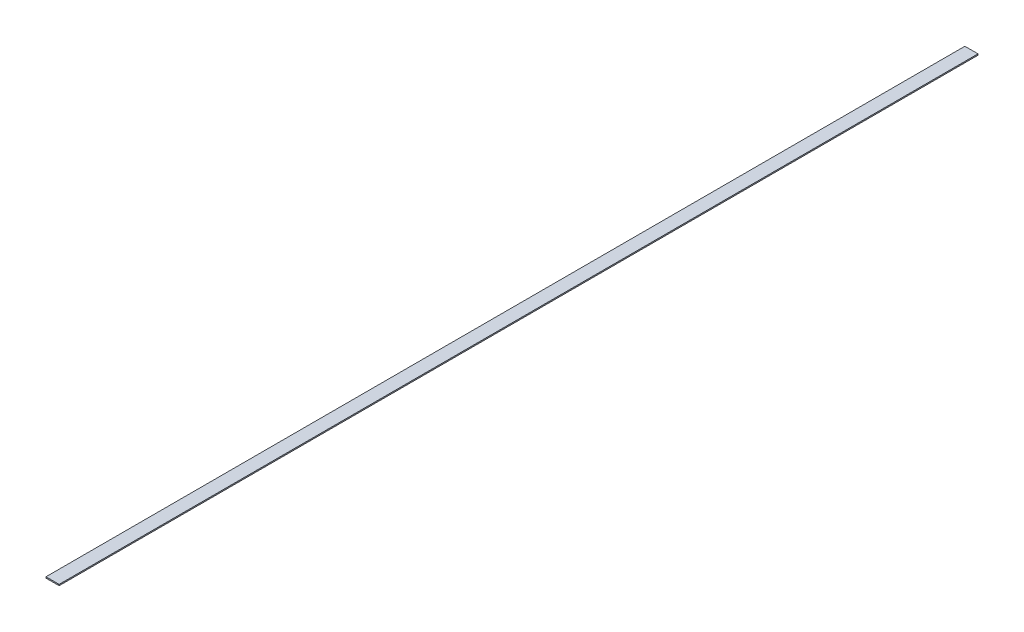
ISO-10303-21;
HEADER;
FILE_DESCRIPTION(('STEP AP214'),'2;1');
FILE_NAME('part.step','',(''),(''),'','','');
FILE_SCHEMA(('AUTOMOTIVE_DESIGN { 1 0 10303 214 1 1 1 1 }'));
ENDSEC;
DATA;
#1=APPLICATION_CONTEXT('core data for automotive mechanical design processes');
#2=APPLICATION_PROTOCOL_DEFINITION('international standard','automotive_design',2000,#1);
#3=PRODUCT_CONTEXT('',#1,'mechanical');
#4=PRODUCT('Part','Part','',(#3));
#5=PRODUCT_RELATED_PRODUCT_CATEGORY('part','',(#4));
#6=PRODUCT_DEFINITION_FORMATION('','',#4);
#7=PRODUCT_DEFINITION_CONTEXT('part definition',#1,'design');
#8=PRODUCT_DEFINITION('design','',#6,#7);
#9=PRODUCT_DEFINITION_SHAPE('','',#8);
#10=(LENGTH_UNIT() NAMED_UNIT(*) SI_UNIT(.MILLI.,.METRE.));
#11=(NAMED_UNIT(*) PLANE_ANGLE_UNIT() SI_UNIT($,.RADIAN.));
#12=(NAMED_UNIT(*) SI_UNIT($,.STERADIAN.) SOLID_ANGLE_UNIT());
#13=UNCERTAINTY_MEASURE_WITH_UNIT(LENGTH_MEASURE(1.E-05),#10,'distance_accuracy_value','');
#14=(GEOMETRIC_REPRESENTATION_CONTEXT(3) GLOBAL_UNCERTAINTY_ASSIGNED_CONTEXT((#13)) GLOBAL_UNIT_ASSIGNED_CONTEXT((#10,
#11,#12)) REPRESENTATION_CONTEXT('',''));
#15=CARTESIAN_POINT('',(0.,0.,0.));
#16=DIRECTION('',(0.,0.,1.));
#17=DIRECTION('',(1.,0.,0.));
#18=AXIS2_PLACEMENT_3D('',#15,#16,#17);
#19=CARTESIAN_POINT('',(-44.4152323486615,29.4091029218006,3556.));
#20=DIRECTION('',(1.,0.,0.));
#21=DIRECTION('',(0.,0.,-1.));
#22=AXIS2_PLACEMENT_3D('',#19,#20,#21);
#23=PLANE('',#22);
#24=DIRECTION('',(0.,-1.,0.));
#25=VECTOR('',#24,1.);
#26=CARTESIAN_POINT('',(-44.4152323486615,29.4091029218006,0.));
#27=LINE('',#26,#25);
#28=CARTESIAN_POINT('',(-44.4152323486615,29.4091029218006,0.));
#29=VERTEX_POINT('',#28);
#30=CARTESIAN_POINT('',(-44.4152323486615,24.6466029218006,0.));
#31=VERTEX_POINT('',#30);
#32=EDGE_CURVE('E95',#29,#31,#27,.T.);
#33=ORIENTED_EDGE('',*,*,#32,.T.);
#34=DIRECTION('',(0.,0.,-1.));
#35=VECTOR('',#34,1.);
#36=CARTESIAN_POINT('',(-44.4152323486615,24.6466029218006,3556.));
#37=LINE('',#36,#35);
#38=CARTESIAN_POINT('',(-44.4152323486615,24.6466029218006,3556.));
#39=VERTEX_POINT('',#38);
#40=EDGE_CURVE('E11',#39,#31,#37,.T.);
#41=ORIENTED_EDGE('',*,*,#40,.F.);
#42=DIRECTION('',(0.,-1.,0.));
#43=VECTOR('',#42,1.);
#44=CARTESIAN_POINT('',(-44.4152323486615,29.4091029218006,3556.));
#45=LINE('',#44,#43);
#46=CARTESIAN_POINT('',(-44.4152323486615,29.4091029218006,3556.));
#47=VERTEX_POINT('',#46);
#48=EDGE_CURVE('E83',#47,#39,#45,.T.);
#49=ORIENTED_EDGE('',*,*,#48,.F.);
#50=DIRECTION('',(0.,0.,-1.));
#51=VECTOR('',#50,1.);
#52=CARTESIAN_POINT('',(-44.4152323486615,29.4091029218006,3556.));
#53=LINE('',#52,#51);
#54=EDGE_CURVE('E91',#47,#29,#53,.T.);
#55=ORIENTED_EDGE('',*,*,#54,.T.);
#56=EDGE_LOOP('',(#33,#41,#49,#55));
#57=FACE_BOUND('',#56,.T.);
#58=ADVANCED_FACE('F32',(#57),#23,.F.);
#59=CARTESIAN_POINT('',(-44.4152323486615,24.6466029218006,3556.));
#60=DIRECTION('',(0.,1.,0.));
#61=DIRECTION('',(0.,0.,1.));
#62=AXIS2_PLACEMENT_3D('',#59,#60,#61);
#63=PLANE('',#62);
#64=DIRECTION('',(1.,0.,0.));
#65=VECTOR('',#64,1.);
#66=CARTESIAN_POINT('',(-44.4152323486615,24.6466029218006,0.));
#67=LINE('',#66,#65);
#68=CARTESIAN_POINT('',(6.38476765133846,24.6466029218006,0.));
#69=VERTEX_POINT('',#68);
#70=EDGE_CURVE('E87',#31,#69,#67,.T.);
#71=ORIENTED_EDGE('',*,*,#70,.T.);
#72=DIRECTION('',(0.,0.,-1.));
#73=VECTOR('',#72,1.);
#74=CARTESIAN_POINT('',(6.38476765133846,24.6466029218006,3556.));
#75=LINE('',#74,#73);
#76=CARTESIAN_POINT('',(6.38476765133846,24.6466029218006,3556.));
#77=VERTEX_POINT('',#76);
#78=EDGE_CURVE('E40',#77,#69,#75,.T.);
#79=ORIENTED_EDGE('',*,*,#78,.F.);
#80=DIRECTION('',(1.,0.,0.));
#81=VECTOR('',#80,1.);
#82=CARTESIAN_POINT('',(-44.4152323486615,24.6466029218006,3556.));
#83=LINE('',#82,#81);
#84=EDGE_CURVE('E78',#39,#77,#83,.T.);
#85=ORIENTED_EDGE('',*,*,#84,.F.);
#86=ORIENTED_EDGE('',*,*,#40,.T.);
#87=EDGE_LOOP('',(#71,#79,#85,#86));
#88=FACE_BOUND('',#87,.T.);
#89=ADVANCED_FACE('F86',(#88),#63,.F.);
#90=CARTESIAN_POINT('',(6.38476765133845,29.4091029218006,3556.));
#91=DIRECTION('',(-1.,0.,0.));
#92=DIRECTION('',(0.,-1.,0.));
#93=AXIS2_PLACEMENT_3D('',#90,#91,#92);
#94=PLANE('',#93);
#95=DIRECTION('',(0.,1.,0.));
#96=VECTOR('',#95,1.);
#97=CARTESIAN_POINT('',(6.38476765133845,29.4091029218006,0.));
#98=LINE('',#97,#96);
#99=CARTESIAN_POINT('',(6.38476765133845,29.4091029218006,0.));
#100=VERTEX_POINT('',#99);
#101=EDGE_CURVE('E65',#69,#100,#98,.T.);
#102=ORIENTED_EDGE('',*,*,#101,.T.);
#103=DIRECTION('',(0.,0.,-1.));
#104=VECTOR('',#103,1.);
#105=CARTESIAN_POINT('',(6.38476765133845,29.4091029218006,3556.));
#106=LINE('',#105,#104);
#107=CARTESIAN_POINT('',(6.38476765133845,29.4091029218006,3556.));
#108=VERTEX_POINT('',#107);
#109=EDGE_CURVE('E88',#108,#100,#106,.T.);
#110=ORIENTED_EDGE('',*,*,#109,.F.);
#111=DIRECTION('',(0.,1.,0.));
#112=VECTOR('',#111,1.);
#113=CARTESIAN_POINT('',(6.38476765133845,29.4091029218006,3556.));
#114=LINE('',#113,#112);
#115=EDGE_CURVE('E81',#77,#108,#114,.T.);
#116=ORIENTED_EDGE('',*,*,#115,.F.);
#117=ORIENTED_EDGE('',*,*,#78,.T.);
#118=EDGE_LOOP('',(#102,#110,#116,#117));
#119=FACE_BOUND('',#118,.T.);
#120=ADVANCED_FACE('F89',(#119),#94,.F.);
#121=CARTESIAN_POINT('',(-44.4152323486615,29.4091029218006,3556.));
#122=DIRECTION('',(0.,-1.,0.));
#123=DIRECTION('',(0.,0.,-1.));
#124=AXIS2_PLACEMENT_3D('',#121,#122,#123);
#125=PLANE('',#124);
#126=DIRECTION('',(-1.,0.,0.));
#127=VECTOR('',#126,1.);
#128=CARTESIAN_POINT('',(-44.4152323486615,29.4091029218006,0.));
#129=LINE('',#128,#127);
#130=EDGE_CURVE('E71',#100,#29,#129,.T.);
#131=ORIENTED_EDGE('',*,*,#130,.T.);
#132=ORIENTED_EDGE('',*,*,#54,.F.);
#133=DIRECTION('',(-1.,0.,0.));
#134=VECTOR('',#133,1.);
#135=CARTESIAN_POINT('',(-44.4152323486615,29.4091029218006,3556.));
#136=LINE('',#135,#134);
#137=EDGE_CURVE('E48',#108,#47,#136,.T.);
#138=ORIENTED_EDGE('',*,*,#137,.F.);
#139=ORIENTED_EDGE('',*,*,#109,.T.);
#140=EDGE_LOOP('',(#131,#132,#138,#139));
#141=FACE_BOUND('',#140,.T.);
#142=ADVANCED_FACE('F102',(#141),#125,.F.);
#143=CARTESIAN_POINT('',(-44.4152323486615,24.6466029218006,3556.));
#144=DIRECTION('',(0.,0.,1.));
#145=DIRECTION('',(1.,0.,0.));
#146=AXIS2_PLACEMENT_3D('',#143,#144,#145);
#147=PLANE('',#146);
#148=ORIENTED_EDGE('',*,*,#48,.T.);
#149=ORIENTED_EDGE('',*,*,#84,.T.);
#150=ORIENTED_EDGE('',*,*,#115,.T.);
#151=ORIENTED_EDGE('',*,*,#137,.T.);
#152=EDGE_LOOP('',(#148,#149,#150,#151));
#153=FACE_BOUND('',#152,.T.);
#154=ADVANCED_FACE('F79',(#153),#147,.T.);
#155=CARTESIAN_POINT('',(-44.4152323486615,24.6466029218006,0.));
#156=DIRECTION('',(0.,0.,1.));
#157=DIRECTION('',(1.,0.,0.));
#158=AXIS2_PLACEMENT_3D('',#155,#156,#157);
#159=PLANE('',#158);
#160=ORIENTED_EDGE('',*,*,#32,.F.);
#161=ORIENTED_EDGE('',*,*,#130,.F.);
#162=ORIENTED_EDGE('',*,*,#101,.F.);
#163=ORIENTED_EDGE('',*,*,#70,.F.);
#164=EDGE_LOOP('',(#160,#161,#162,#163));
#165=FACE_BOUND('',#164,.T.);
#166=ADVANCED_FACE('F105',(#165),#159,.F.);
#167=CLOSED_SHELL('',(#58,#89,#120,#142,#154,#166));
#168=MANIFOLD_SOLID_BREP('B2',#167);
#169=ADVANCED_BREP_SHAPE_REPRESENTATION('',(#18,#168),#14);
#170=SHAPE_DEFINITION_REPRESENTATION(#9,#169);
ENDSEC;
END-ISO-10303-21;
